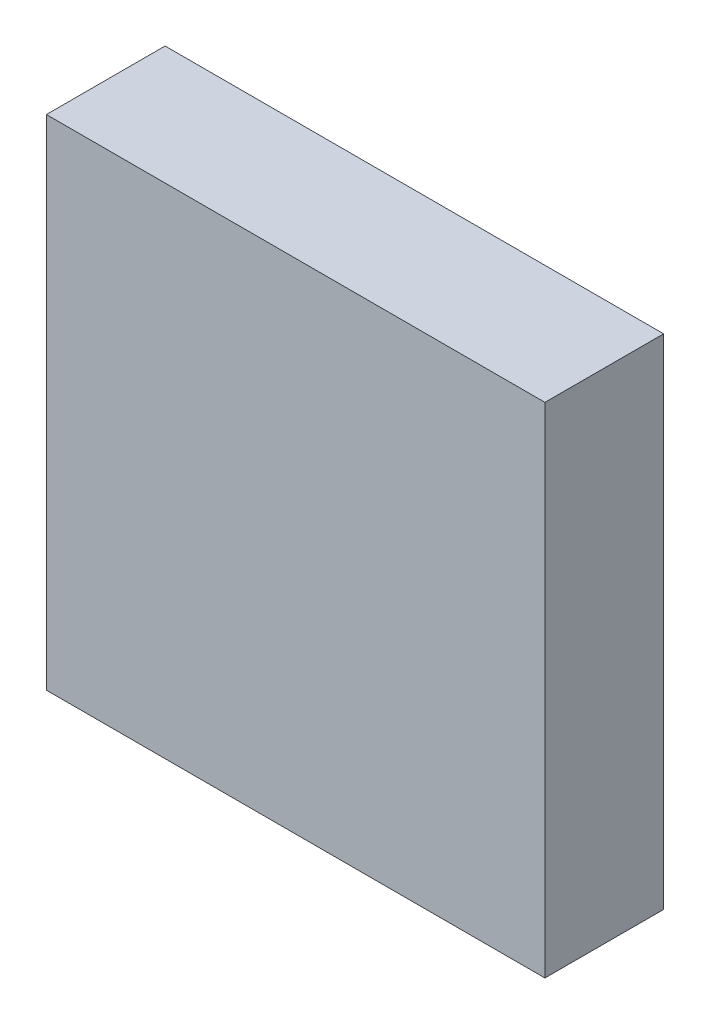
ISO-10303-21;
HEADER;
FILE_DESCRIPTION(('STEP AP214'),'2;1');
FILE_NAME('part.step','',(''),(''),'','','');
FILE_SCHEMA(('AUTOMOTIVE_DESIGN { 1 0 10303 214 1 1 1 1 }'));
ENDSEC;
DATA;
#1=APPLICATION_CONTEXT('core data for automotive mechanical design processes');
#2=APPLICATION_PROTOCOL_DEFINITION('international standard','automotive_design',2000,#1);
#3=PRODUCT_CONTEXT('',#1,'mechanical');
#4=PRODUCT('Part','Part','',(#3));
#5=PRODUCT_RELATED_PRODUCT_CATEGORY('part','',(#4));
#6=PRODUCT_DEFINITION_FORMATION('','',#4);
#7=PRODUCT_DEFINITION_CONTEXT('part definition',#1,'design');
#8=PRODUCT_DEFINITION('design','',#6,#7);
#9=PRODUCT_DEFINITION_SHAPE('','',#8);
#10=(LENGTH_UNIT() NAMED_UNIT(*) SI_UNIT(.MILLI.,.METRE.));
#11=(NAMED_UNIT(*) PLANE_ANGLE_UNIT() SI_UNIT($,.RADIAN.));
#12=(NAMED_UNIT(*) SI_UNIT($,.STERADIAN.) SOLID_ANGLE_UNIT());
#13=UNCERTAINTY_MEASURE_WITH_UNIT(LENGTH_MEASURE(1.E-05),#10,'distance_accuracy_value','');
#14=(GEOMETRIC_REPRESENTATION_CONTEXT(3) GLOBAL_UNCERTAINTY_ASSIGNED_CONTEXT((#13)) GLOBAL_UNIT_ASSIGNED_CONTEXT((#10,
#11,#12)) REPRESENTATION_CONTEXT('',''));
#15=CARTESIAN_POINT('',(0.,0.,0.));
#16=DIRECTION('',(0.,0.,1.));
#17=DIRECTION('',(1.,0.,0.));
#18=AXIS2_PLACEMENT_3D('',#15,#16,#17);
#19=CARTESIAN_POINT('',(0.,0.,5.));
#20=DIRECTION('',(1.,0.,0.));
#21=DIRECTION('',(0.,0.,-1.));
#22=AXIS2_PLACEMENT_3D('',#19,#20,#21);
#23=PLANE('',#22);
#24=DIRECTION('',(0.,-1.,0.));
#25=VECTOR('',#24,1.);
#26=CARTESIAN_POINT('',(0.,0.,0.));
#27=LINE('',#26,#25);
#28=CARTESIAN_POINT('',(0.,21.,0.));
#29=VERTEX_POINT('',#28);
#30=CARTESIAN_POINT('',(0.,0.,0.));
#31=VERTEX_POINT('',#30);
#32=EDGE_CURVE('E105',#29,#31,#27,.T.);
#33=ORIENTED_EDGE('',*,*,#32,.T.);
#34=DIRECTION('',(0.,0.,-1.));
#35=VECTOR('',#34,1.);
#36=CARTESIAN_POINT('',(0.,0.,5.));
#37=LINE('',#36,#35);
#38=CARTESIAN_POINT('',(0.,0.,5.));
#39=VERTEX_POINT('',#38);
#40=EDGE_CURVE('E11',#39,#31,#37,.T.);
#41=ORIENTED_EDGE('',*,*,#40,.F.);
#42=DIRECTION('',(0.,-1.,0.));
#43=VECTOR('',#42,1.);
#44=CARTESIAN_POINT('',(0.,0.,5.));
#45=LINE('',#44,#43);
#46=CARTESIAN_POINT('',(0.,21.,5.));
#47=VERTEX_POINT('',#46);
#48=EDGE_CURVE('E89',#47,#39,#45,.T.);
#49=ORIENTED_EDGE('',*,*,#48,.F.);
#50=DIRECTION('',(0.,0.,-1.));
#51=VECTOR('',#50,1.);
#52=CARTESIAN_POINT('',(0.,21.,5.));
#53=LINE('',#52,#51);
#54=EDGE_CURVE('E97',#47,#29,#53,.T.);
#55=ORIENTED_EDGE('',*,*,#54,.T.);
#56=EDGE_LOOP('',(#33,#41,#49,#55));
#57=FACE_BOUND('',#56,.T.);
#58=ADVANCED_FACE('F39',(#57),#23,.F.);
#59=CARTESIAN_POINT('',(0.,0.,5.));
#60=DIRECTION('',(0.,1.,0.));
#61=DIRECTION('',(0.,0.,1.));
#62=AXIS2_PLACEMENT_3D('',#59,#60,#61);
#63=PLANE('',#62);
#64=DIRECTION('',(1.,0.,0.));
#65=VECTOR('',#64,1.);
#66=CARTESIAN_POINT('',(0.,0.,0.));
#67=LINE('',#66,#65);
#68=CARTESIAN_POINT('',(21.,0.,0.));
#69=VERTEX_POINT('',#68);
#70=EDGE_CURVE('E92',#31,#69,#67,.T.);
#71=ORIENTED_EDGE('',*,*,#70,.T.);
#72=DIRECTION('',(0.,0.,-1.));
#73=VECTOR('',#72,1.);
#74=CARTESIAN_POINT('',(21.,0.,5.));
#75=LINE('',#74,#73);
#76=CARTESIAN_POINT('',(21.,0.,5.));
#77=VERTEX_POINT('',#76);
#78=EDGE_CURVE('E50',#77,#69,#75,.T.);
#79=ORIENTED_EDGE('',*,*,#78,.F.);
#80=DIRECTION('',(1.,0.,0.));
#81=VECTOR('',#80,1.);
#82=CARTESIAN_POINT('',(0.,0.,5.));
#83=LINE('',#82,#81);
#84=EDGE_CURVE('E82',#39,#77,#83,.T.);
#85=ORIENTED_EDGE('',*,*,#84,.F.);
#86=ORIENTED_EDGE('',*,*,#40,.T.);
#87=EDGE_LOOP('',(#71,#79,#85,#86));
#88=FACE_BOUND('',#87,.T.);
#89=ADVANCED_FACE('F93',(#88),#63,.F.);
#90=CARTESIAN_POINT('',(21.,0.,5.));
#91=DIRECTION('',(-1.,0.,0.));
#92=DIRECTION('',(0.,0.,1.));
#93=AXIS2_PLACEMENT_3D('',#90,#91,#92);
#94=PLANE('',#93);
#95=DIRECTION('',(0.,1.,0.));
#96=VECTOR('',#95,1.);
#97=CARTESIAN_POINT('',(21.,0.,0.));
#98=LINE('',#97,#96);
#99=CARTESIAN_POINT('',(21.,21.,0.));
#100=VERTEX_POINT('',#99);
#101=EDGE_CURVE('E72',#69,#100,#98,.T.);
#102=ORIENTED_EDGE('',*,*,#101,.T.);
#103=DIRECTION('',(0.,0.,-1.));
#104=VECTOR('',#103,1.);
#105=CARTESIAN_POINT('',(21.,21.,5.));
#106=LINE('',#105,#104);
#107=CARTESIAN_POINT('',(21.,21.,5.));
#108=VERTEX_POINT('',#107);
#109=EDGE_CURVE('E94',#108,#100,#106,.T.);
#110=ORIENTED_EDGE('',*,*,#109,.F.);
#111=DIRECTION('',(0.,1.,0.));
#112=VECTOR('',#111,1.);
#113=CARTESIAN_POINT('',(21.,0.,5.));
#114=LINE('',#113,#112);
#115=EDGE_CURVE('E88',#77,#108,#114,.T.);
#116=ORIENTED_EDGE('',*,*,#115,.F.);
#117=ORIENTED_EDGE('',*,*,#78,.T.);
#118=EDGE_LOOP('',(#102,#110,#116,#117));
#119=FACE_BOUND('',#118,.T.);
#120=ADVANCED_FACE('F96',(#119),#94,.F.);
#121=CARTESIAN_POINT('',(0.,21.,5.));
#122=DIRECTION('',(0.,-1.,0.));
#123=DIRECTION('',(0.,0.,-1.));
#124=AXIS2_PLACEMENT_3D('',#121,#122,#123);
#125=PLANE('',#124);
#126=DIRECTION('',(-1.,0.,0.));
#127=VECTOR('',#126,1.);
#128=CARTESIAN_POINT('',(0.,21.,0.));
#129=LINE('',#128,#127);
#130=EDGE_CURVE('E76',#100,#29,#129,.T.);
#131=ORIENTED_EDGE('',*,*,#130,.T.);
#132=ORIENTED_EDGE('',*,*,#54,.F.);
#133=DIRECTION('',(-1.,0.,0.));
#134=VECTOR('',#133,1.);
#135=CARTESIAN_POINT('',(0.,21.,5.));
#136=LINE('',#135,#134);
#137=EDGE_CURVE('E54',#108,#47,#136,.T.);
#138=ORIENTED_EDGE('',*,*,#137,.F.);
#139=ORIENTED_EDGE('',*,*,#109,.T.);
#140=EDGE_LOOP('',(#131,#132,#138,#139));
#141=FACE_BOUND('',#140,.T.);
#142=ADVANCED_FACE('F108',(#141),#125,.F.);
#143=CARTESIAN_POINT('',(0.,0.,5.));
#144=DIRECTION('',(0.,0.,-1.));
#145=DIRECTION('',(-1.,0.,0.));
#146=AXIS2_PLACEMENT_3D('',#143,#144,#145);
#147=PLANE('',#146);
#148=ORIENTED_EDGE('',*,*,#48,.T.);
#149=ORIENTED_EDGE('',*,*,#84,.T.);
#150=ORIENTED_EDGE('',*,*,#115,.T.);
#151=ORIENTED_EDGE('',*,*,#137,.T.);
#152=EDGE_LOOP('',(#148,#149,#150,#151));
#153=FACE_BOUND('',#152,.T.);
#154=ADVANCED_FACE('F86',(#153),#147,.F.);
#155=CARTESIAN_POINT('',(0.,0.,0.));
#156=DIRECTION('',(0.,0.,-1.));
#157=DIRECTION('',(-1.,0.,0.));
#158=AXIS2_PLACEMENT_3D('',#155,#156,#157);
#159=PLANE('',#158);
#160=ORIENTED_EDGE('',*,*,#32,.F.);
#161=ORIENTED_EDGE('',*,*,#130,.F.);
#162=ORIENTED_EDGE('',*,*,#101,.F.);
#163=ORIENTED_EDGE('',*,*,#70,.F.);
#164=EDGE_LOOP('',(#160,#161,#162,#163));
#165=FACE_BOUND('',#164,.T.);
#166=ADVANCED_FACE('F115',(#165),#159,.T.);
#167=CLOSED_SHELL('',(#58,#89,#120,#142,#154,#166));
#168=MANIFOLD_SOLID_BREP('B2',#167);
#169=ADVANCED_BREP_SHAPE_REPRESENTATION('',(#18,#168),#14);
#170=SHAPE_DEFINITION_REPRESENTATION(#9,#169);
ENDSEC;
END-ISO-10303-21;
